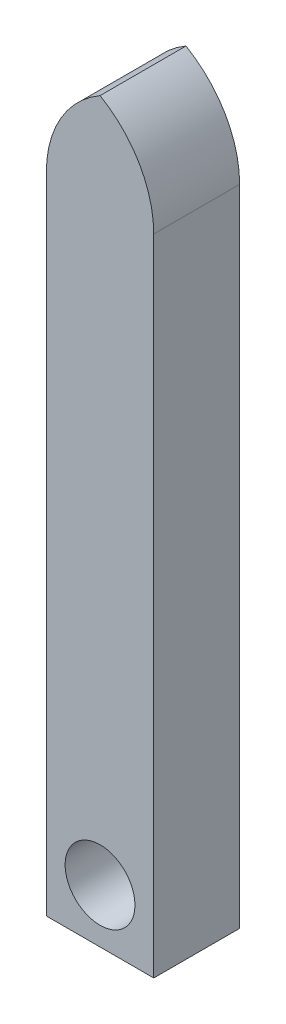
ISO-10303-21;
HEADER;
FILE_DESCRIPTION(('STEP AP214'),'2;1');
FILE_NAME('part.step','',(''),(''),'','','');
FILE_SCHEMA(('AUTOMOTIVE_DESIGN { 1 0 10303 214 1 1 1 1 }'));
ENDSEC;
DATA;
#1=APPLICATION_CONTEXT('core data for automotive mechanical design processes');
#2=APPLICATION_PROTOCOL_DEFINITION('international standard','automotive_design',2000,#1);
#3=PRODUCT_CONTEXT('',#1,'mechanical');
#4=PRODUCT('Part','Part','',(#3));
#5=PRODUCT_RELATED_PRODUCT_CATEGORY('part','',(#4));
#6=PRODUCT_DEFINITION_FORMATION('','',#4);
#7=PRODUCT_DEFINITION_CONTEXT('part definition',#1,'design');
#8=PRODUCT_DEFINITION('design','',#6,#7);
#9=PRODUCT_DEFINITION_SHAPE('','',#8);
#10=(LENGTH_UNIT() NAMED_UNIT(*) SI_UNIT(.MILLI.,.METRE.));
#11=(NAMED_UNIT(*) PLANE_ANGLE_UNIT() SI_UNIT($,.RADIAN.));
#12=(NAMED_UNIT(*) SI_UNIT($,.STERADIAN.) SOLID_ANGLE_UNIT());
#13=UNCERTAINTY_MEASURE_WITH_UNIT(LENGTH_MEASURE(1.E-05),#10,'distance_accuracy_value','');
#14=(GEOMETRIC_REPRESENTATION_CONTEXT(3) GLOBAL_UNCERTAINTY_ASSIGNED_CONTEXT((#13)) GLOBAL_UNIT_ASSIGNED_CONTEXT((#10,
#11,#12)) REPRESENTATION_CONTEXT('',''));
#15=CARTESIAN_POINT('',(0.,0.,0.));
#16=DIRECTION('',(0.,0.,1.));
#17=DIRECTION('',(1.,0.,0.));
#18=AXIS2_PLACEMENT_3D('',#15,#16,#17);
#19=CARTESIAN_POINT('',(0.,0.,4.));
#20=DIRECTION('',(0.,0.,-1.));
#21=DIRECTION('',(-1.,0.,0.));
#22=AXIS2_PLACEMENT_3D('',#19,#20,#21);
#23=PLANE('',#22);
#24=CARTESIAN_POINT('',(-2.5,12.5,4.));
#25=DIRECTION('',(0.,0.,-1.));
#26=DIRECTION('',(-1.,0.,0.));
#27=AXIS2_PLACEMENT_3D('',#24,#25,#26);
#28=CIRCLE('',#27,5.);
#29=CARTESIAN_POINT('',(2.5,12.5,4.));
#30=VERTEX_POINT('',#29);
#31=CARTESIAN_POINT('',(0.,16.8301270189222,4.));
#32=VERTEX_POINT('',#31);
#33=EDGE_CURVE('E49',#30,#32,#28,.F.);
#34=ORIENTED_EDGE('',*,*,#33,.T.);
#35=CARTESIAN_POINT('',(2.5,12.5,4.));
#36=DIRECTION('',(0.,0.,-1.));
#37=DIRECTION('',(-1.,0.,0.));
#38=AXIS2_PLACEMENT_3D('',#35,#36,#37);
#39=CIRCLE('',#38,5.);
#40=CARTESIAN_POINT('',(-2.5,12.5,4.));
#41=VERTEX_POINT('',#40);
#42=EDGE_CURVE('E42',#32,#41,#39,.F.);
#43=ORIENTED_EDGE('',*,*,#42,.T.);
#44=DIRECTION('',(0.,-1.,0.));
#45=VECTOR('',#44,1.);
#46=CARTESIAN_POINT('',(-2.5,-17.5,4.));
#47=LINE('',#46,#45);
#48=CARTESIAN_POINT('',(-2.5,-17.5,4.));
#49=VERTEX_POINT('',#48);
#50=EDGE_CURVE('E79',#41,#49,#47,.T.);
#51=ORIENTED_EDGE('',*,*,#50,.T.);
#52=DIRECTION('',(1.,0.,0.));
#53=VECTOR('',#52,1.);
#54=CARTESIAN_POINT('',(-2.5,-17.5,4.));
#55=LINE('',#54,#53);
#56=CARTESIAN_POINT('',(2.5,-17.5,4.));
#57=VERTEX_POINT('',#56);
#58=EDGE_CURVE('E83',#49,#57,#55,.T.);
#59=ORIENTED_EDGE('',*,*,#58,.T.);
#60=DIRECTION('',(0.,1.,0.));
#61=VECTOR('',#60,1.);
#62=CARTESIAN_POINT('',(2.5,-17.5,4.));
#63=LINE('',#62,#61);
#64=EDGE_CURVE('E89',#57,#30,#63,.T.);
#65=ORIENTED_EDGE('',*,*,#64,.T.);
#66=EDGE_LOOP('',(#34,#43,#51,#59,#65));
#67=FACE_BOUND('',#66,.T.);
#68=CARTESIAN_POINT('',(0.,-15.,4.));
#69=DIRECTION('',(0.,0.,1.));
#70=DIRECTION('',(1.,0.,0.));
#71=AXIS2_PLACEMENT_3D('',#68,#69,#70);
#72=CIRCLE('',#71,1.625);
#73=CARTESIAN_POINT('',(1.625,-15.,4.));
#74=VERTEX_POINT('',#73);
#75=EDGE_CURVE('E109',#74,#74,#72,.T.);
#76=ORIENTED_EDGE('',*,*,#75,.F.);
#77=EDGE_LOOP('',(#76));
#78=FACE_BOUND('',#77,.T.);
#79=ADVANCED_FACE('F33',(#67,#78),#23,.F.);
#80=CARTESIAN_POINT('',(0.,0.,0.));
#81=DIRECTION('',(0.,0.,-1.));
#82=DIRECTION('',(-1.,0.,0.));
#83=AXIS2_PLACEMENT_3D('',#80,#81,#82);
#84=PLANE('',#83);
#85=DIRECTION('',(0.,-1.,0.));
#86=VECTOR('',#85,1.);
#87=CARTESIAN_POINT('',(-2.5,-17.5,0.));
#88=LINE('',#87,#86);
#89=CARTESIAN_POINT('',(-2.5,12.5,0.));
#90=VERTEX_POINT('',#89);
#91=CARTESIAN_POINT('',(-2.5,-17.5,0.));
#92=VERTEX_POINT('',#91);
#93=EDGE_CURVE('E95',#90,#92,#88,.T.);
#94=ORIENTED_EDGE('',*,*,#93,.F.);
#95=CARTESIAN_POINT('',(2.5,12.5,0.));
#96=DIRECTION('',(0.,0.,-1.));
#97=DIRECTION('',(-1.,0.,0.));
#98=AXIS2_PLACEMENT_3D('',#95,#96,#97);
#99=CIRCLE('',#98,5.);
#100=CARTESIAN_POINT('',(0.,16.8301270189222,0.));
#101=VERTEX_POINT('',#100);
#102=EDGE_CURVE('E116',#90,#101,#99,.T.);
#103=ORIENTED_EDGE('',*,*,#102,.T.);
#104=CARTESIAN_POINT('',(-2.5,12.5,0.));
#105=DIRECTION('',(0.,0.,-1.));
#106=DIRECTION('',(-1.,0.,0.));
#107=AXIS2_PLACEMENT_3D('',#104,#105,#106);
#108=CIRCLE('',#107,5.);
#109=CARTESIAN_POINT('',(2.5,12.5,0.));
#110=VERTEX_POINT('',#109);
#111=EDGE_CURVE('E114',#101,#110,#108,.T.);
#112=ORIENTED_EDGE('',*,*,#111,.T.);
#113=DIRECTION('',(0.,1.,0.));
#114=VECTOR('',#113,1.);
#115=CARTESIAN_POINT('',(2.5,-17.5,0.));
#116=LINE('',#115,#114);
#117=CARTESIAN_POINT('',(2.5,-17.5,0.));
#118=VERTEX_POINT('',#117);
#119=EDGE_CURVE('E107',#118,#110,#116,.T.);
#120=ORIENTED_EDGE('',*,*,#119,.F.);
#121=DIRECTION('',(1.,0.,0.));
#122=VECTOR('',#121,1.);
#123=CARTESIAN_POINT('',(-2.5,-17.5,0.));
#124=LINE('',#123,#122);
#125=EDGE_CURVE('E111',#92,#118,#124,.T.);
#126=ORIENTED_EDGE('',*,*,#125,.F.);
#127=EDGE_LOOP('',(#94,#103,#112,#120,#126));
#128=FACE_BOUND('',#127,.T.);
#129=CARTESIAN_POINT('',(0.,-15.,0.));
#130=DIRECTION('',(0.,0.,1.));
#131=DIRECTION('',(1.,0.,0.));
#132=AXIS2_PLACEMENT_3D('',#129,#130,#131);
#133=CIRCLE('',#132,1.625);
#134=CARTESIAN_POINT('',(1.625,-15.,0.));
#135=VERTEX_POINT('',#134);
#136=EDGE_CURVE('E128',#135,#135,#133,.T.);
#137=ORIENTED_EDGE('',*,*,#136,.T.);
#138=EDGE_LOOP('',(#137));
#139=FACE_BOUND('',#138,.T.);
#140=ADVANCED_FACE('F121',(#128,#139),#84,.T.);
#141=CARTESIAN_POINT('',(2.5,-17.5,4.));
#142=DIRECTION('',(-1.,0.,0.));
#143=DIRECTION('',(0.,0.,1.));
#144=AXIS2_PLACEMENT_3D('',#141,#142,#143);
#145=PLANE('',#144);
#146=ORIENTED_EDGE('',*,*,#119,.T.);
#147=DIRECTION('',(0.,0.,-1.));
#148=VECTOR('',#147,1.);
#149=CARTESIAN_POINT('',(2.5,12.5,4.));
#150=LINE('',#149,#148);
#151=EDGE_CURVE('E11',#110,#30,#150,.F.);
#152=ORIENTED_EDGE('',*,*,#151,.T.);
#153=ORIENTED_EDGE('',*,*,#64,.F.);
#154=DIRECTION('',(0.,0.,-1.));
#155=VECTOR('',#154,1.);
#156=CARTESIAN_POINT('',(2.5,-17.5,4.));
#157=LINE('',#156,#155);
#158=EDGE_CURVE('E99',#57,#118,#157,.T.);
#159=ORIENTED_EDGE('',*,*,#158,.T.);
#160=EDGE_LOOP('',(#146,#152,#153,#159));
#161=FACE_BOUND('',#160,.T.);
#162=ADVANCED_FACE('F134',(#161),#145,.F.);
#163=CARTESIAN_POINT('',(-2.5,-17.5,4.));
#164=DIRECTION('',(1.,0.,0.));
#165=DIRECTION('',(0.,0.,-1.));
#166=AXIS2_PLACEMENT_3D('',#163,#164,#165);
#167=PLANE('',#166);
#168=ORIENTED_EDGE('',*,*,#50,.F.);
#169=DIRECTION('',(0.,0.,-1.));
#170=VECTOR('',#169,1.);
#171=CARTESIAN_POINT('',(-2.5,12.5,4.));
#172=LINE('',#171,#170);
#173=EDGE_CURVE('E98',#41,#90,#172,.T.);
#174=ORIENTED_EDGE('',*,*,#173,.T.);
#175=ORIENTED_EDGE('',*,*,#93,.T.);
#176=DIRECTION('',(0.,0.,-1.));
#177=VECTOR('',#176,1.);
#178=CARTESIAN_POINT('',(-2.5,-17.5,4.));
#179=LINE('',#178,#177);
#180=EDGE_CURVE('E92',#49,#92,#179,.T.);
#181=ORIENTED_EDGE('',*,*,#180,.F.);
#182=EDGE_LOOP('',(#168,#174,#175,#181));
#183=FACE_BOUND('',#182,.T.);
#184=ADVANCED_FACE('F93',(#183),#167,.F.);
#185=CARTESIAN_POINT('',(-2.5,-17.5,4.));
#186=DIRECTION('',(0.,1.,0.));
#187=DIRECTION('',(0.,0.,1.));
#188=AXIS2_PLACEMENT_3D('',#185,#186,#187);
#189=PLANE('',#188);
#190=ORIENTED_EDGE('',*,*,#125,.T.);
#191=ORIENTED_EDGE('',*,*,#158,.F.);
#192=ORIENTED_EDGE('',*,*,#58,.F.);
#193=ORIENTED_EDGE('',*,*,#180,.T.);
#194=EDGE_LOOP('',(#190,#191,#192,#193));
#195=FACE_BOUND('',#194,.T.);
#196=ADVANCED_FACE('F101',(#195),#189,.F.);
#197=CARTESIAN_POINT('',(0.,-15.,4.));
#198=DIRECTION('',(0.,0.,-1.));
#199=DIRECTION('',(-1.,0.,0.));
#200=AXIS2_PLACEMENT_3D('',#197,#198,#199);
#201=CYLINDRICAL_SURFACE('',#200,1.625);
#202=ORIENTED_EDGE('',*,*,#75,.T.);
#203=EDGE_LOOP('',(#202));
#204=FACE_BOUND('',#203,.T.);
#205=ORIENTED_EDGE('',*,*,#136,.F.);
#206=EDGE_LOOP('',(#205));
#207=FACE_BOUND('',#206,.T.);
#208=ADVANCED_FACE('F148',(#204,#207),#201,.F.);
#209=CARTESIAN_POINT('',(-2.5,12.5,4.));
#210=DIRECTION('',(0.,0.,-1.));
#211=DIRECTION('',(-1.,0.,0.));
#212=AXIS2_PLACEMENT_3D('',#209,#210,#211);
#213=CYLINDRICAL_SURFACE('',#212,5.);
#214=DIRECTION('',(0.,0.,-1.));
#215=VECTOR('',#214,1.);
#216=CARTESIAN_POINT('',(0.,16.8301270189222,2.));
#217=LINE('',#216,#215);
#218=EDGE_CURVE('E37',#32,#101,#217,.T.);
#219=ORIENTED_EDGE('',*,*,#218,.F.);
#220=ORIENTED_EDGE('',*,*,#33,.F.);
#221=ORIENTED_EDGE('',*,*,#151,.F.);
#222=ORIENTED_EDGE('',*,*,#111,.F.);
#223=EDGE_LOOP('',(#219,#220,#221,#222));
#224=FACE_BOUND('',#223,.T.);
#225=ADVANCED_FACE('F35',(#224),#213,.T.);
#226=CARTESIAN_POINT('',(2.5,12.5,4.));
#227=DIRECTION('',(0.,0.,-1.));
#228=DIRECTION('',(-1.,0.,0.));
#229=AXIS2_PLACEMENT_3D('',#226,#227,#228);
#230=CYLINDRICAL_SURFACE('',#229,5.);
#231=ORIENTED_EDGE('',*,*,#42,.F.);
#232=ORIENTED_EDGE('',*,*,#218,.T.);
#233=ORIENTED_EDGE('',*,*,#102,.F.);
#234=ORIENTED_EDGE('',*,*,#173,.F.);
#235=EDGE_LOOP('',(#231,#232,#233,#234));
#236=FACE_BOUND('',#235,.T.);
#237=ADVANCED_FACE('F127',(#236),#230,.T.);
#238=CLOSED_SHELL('',(#79,#140,#162,#184,#196,#208,#225,#237));
#239=MANIFOLD_SOLID_BREP('B2',#238);
#240=ADVANCED_BREP_SHAPE_REPRESENTATION('',(#18,#239),#14);
#241=SHAPE_DEFINITION_REPRESENTATION(#9,#240);
ENDSEC;
END-ISO-10303-21;
